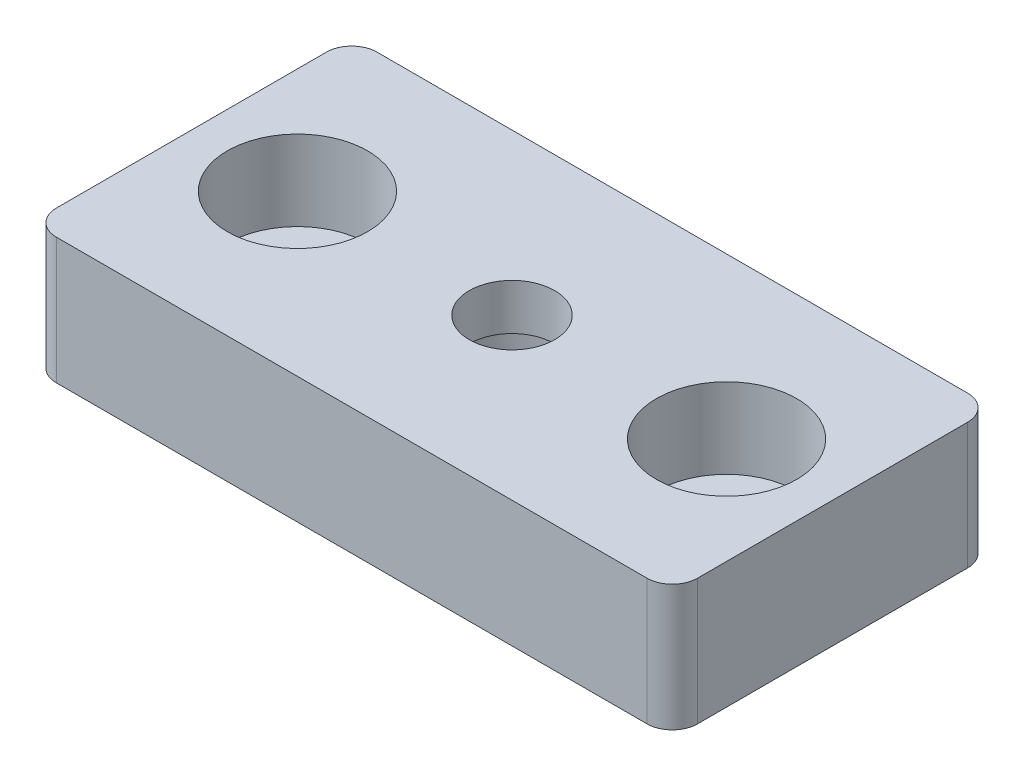
ISO-10303-21;
HEADER;
FILE_DESCRIPTION(('STEP AP214'),'2;1');
FILE_NAME('part.step','',(''),(''),'','','');
FILE_SCHEMA(('AUTOMOTIVE_DESIGN { 1 0 10303 214 1 1 1 1 }'));
ENDSEC;
DATA;
#1=APPLICATION_CONTEXT('core data for automotive mechanical design processes');
#2=APPLICATION_PROTOCOL_DEFINITION('international standard','automotive_design',2000,#1);
#3=PRODUCT_CONTEXT('',#1,'mechanical');
#4=PRODUCT('Part','Part','',(#3));
#5=PRODUCT_RELATED_PRODUCT_CATEGORY('part','',(#4));
#6=PRODUCT_DEFINITION_FORMATION('','',#4);
#7=PRODUCT_DEFINITION_CONTEXT('part definition',#1,'design');
#8=PRODUCT_DEFINITION('design','',#6,#7);
#9=PRODUCT_DEFINITION_SHAPE('','',#8);
#10=(LENGTH_UNIT() NAMED_UNIT(*) SI_UNIT(.MILLI.,.METRE.));
#11=(NAMED_UNIT(*) PLANE_ANGLE_UNIT() SI_UNIT($,.RADIAN.));
#12=(NAMED_UNIT(*) SI_UNIT($,.STERADIAN.) SOLID_ANGLE_UNIT());
#13=UNCERTAINTY_MEASURE_WITH_UNIT(LENGTH_MEASURE(1.E-05),#10,'distance_accuracy_value','');
#14=(GEOMETRIC_REPRESENTATION_CONTEXT(3) GLOBAL_UNCERTAINTY_ASSIGNED_CONTEXT((#13)) GLOBAL_UNIT_ASSIGNED_CONTEXT((#10,
#11,#12)) REPRESENTATION_CONTEXT('',''));
#15=CARTESIAN_POINT('',(0.,0.,0.));
#16=DIRECTION('',(0.,0.,1.));
#17=DIRECTION('',(1.,0.,0.));
#18=AXIS2_PLACEMENT_3D('',#15,#16,#17);
#19=CARTESIAN_POINT('',(-36.0718631178707,10.,-4.80475285171102));
#20=DIRECTION('',(1.,0.,0.));
#21=DIRECTION('',(0.,0.,-1.));
#22=AXIS2_PLACEMENT_3D('',#19,#20,#21);
#23=PLANE('',#22);
#24=DIRECTION('',(0.,0.,1.));
#25=VECTOR('',#24,1.);
#26=CARTESIAN_POINT('',(-36.0718631178707,0.,-4.80475285171102));
#27=LINE('',#26,#25);
#28=CARTESIAN_POINT('',(-36.0718631178707,0.,-2.80475285171102));
#29=VERTEX_POINT('',#28);
#30=CARTESIAN_POINT('',(-36.0718631178707,0.,18.595247148289));
#31=VERTEX_POINT('',#30);
#32=EDGE_CURVE('E156',#29,#31,#27,.T.);
#33=ORIENTED_EDGE('',*,*,#32,.T.);
#34=DIRECTION('',(0.,-1.,0.));
#35=VECTOR('',#34,1.);
#36=CARTESIAN_POINT('',(-36.0718631178707,10.,18.595247148289));
#37=LINE('',#36,#35);
#38=CARTESIAN_POINT('',(-36.0718631178707,10.,18.595247148289));
#39=VERTEX_POINT('',#38);
#40=EDGE_CURVE('E11',#31,#39,#37,.F.);
#41=ORIENTED_EDGE('',*,*,#40,.T.);
#42=DIRECTION('',(0.,0.,1.));
#43=VECTOR('',#42,1.);
#44=CARTESIAN_POINT('',(-36.0718631178707,10.,-4.80475285171102));
#45=LINE('',#44,#43);
#46=CARTESIAN_POINT('',(-36.0718631178707,10.,-2.80475285171102));
#47=VERTEX_POINT('',#46);
#48=EDGE_CURVE('E124',#47,#39,#45,.T.);
#49=ORIENTED_EDGE('',*,*,#48,.F.);
#50=DIRECTION('',(0.,-1.,0.));
#51=VECTOR('',#50,1.);
#52=CARTESIAN_POINT('',(-36.0718631178707,10.,-2.80475285171102));
#53=LINE('',#52,#51);
#54=EDGE_CURVE('E40',#47,#29,#53,.T.);
#55=ORIENTED_EDGE('',*,*,#54,.T.);
#56=EDGE_LOOP('',(#33,#41,#49,#55));
#57=FACE_BOUND('',#56,.T.);
#58=ADVANCED_FACE('F32',(#57),#23,.F.);
#59=CARTESIAN_POINT('',(-36.0718631178707,10.,20.595247148289));
#60=DIRECTION('',(0.,0.,-1.));
#61=DIRECTION('',(-1.,0.,0.));
#62=AXIS2_PLACEMENT_3D('',#59,#60,#61);
#63=PLANE('',#62);
#64=DIRECTION('',(1.,0.,0.));
#65=VECTOR('',#64,1.);
#66=CARTESIAN_POINT('',(-36.0718631178707,0.,20.595247148289));
#67=LINE('',#66,#65);
#68=CARTESIAN_POINT('',(-34.0718631178707,0.,20.595247148289));
#69=VERTEX_POINT('',#68);
#70=CARTESIAN_POINT('',(12.7281368821293,0.,20.595247148289));
#71=VERTEX_POINT('',#70);
#72=EDGE_CURVE('E129',#69,#71,#67,.T.);
#73=ORIENTED_EDGE('',*,*,#72,.T.);
#74=DIRECTION('',(0.,-1.,0.));
#75=VECTOR('',#74,1.);
#76=CARTESIAN_POINT('',(12.7281368821293,10.,20.595247148289));
#77=LINE('',#76,#75);
#78=CARTESIAN_POINT('',(12.7281368821293,10.,20.595247148289));
#79=VERTEX_POINT('',#78);
#80=EDGE_CURVE('E47',#71,#79,#77,.F.);
#81=ORIENTED_EDGE('',*,*,#80,.T.);
#82=DIRECTION('',(1.,0.,0.));
#83=VECTOR('',#82,1.);
#84=CARTESIAN_POINT('',(-36.0718631178707,10.,20.595247148289));
#85=LINE('',#84,#83);
#86=CARTESIAN_POINT('',(-34.0718631178707,10.,20.595247148289));
#87=VERTEX_POINT('',#86);
#88=EDGE_CURVE('E127',#87,#79,#85,.T.);
#89=ORIENTED_EDGE('',*,*,#88,.F.);
#90=DIRECTION('',(0.,-1.,0.));
#91=VECTOR('',#90,1.);
#92=CARTESIAN_POINT('',(-34.0718631178707,10.,20.595247148289));
#93=LINE('',#92,#91);
#94=EDGE_CURVE('E148',#87,#69,#93,.T.);
#95=ORIENTED_EDGE('',*,*,#94,.T.);
#96=EDGE_LOOP('',(#73,#81,#89,#95));
#97=FACE_BOUND('',#96,.T.);
#98=ADVANCED_FACE('F244',(#97),#63,.F.);
#99=CARTESIAN_POINT('',(14.7281368821293,10.,-4.80475285171102));
#100=DIRECTION('',(-1.,0.,0.));
#101=DIRECTION('',(0.,0.,1.));
#102=AXIS2_PLACEMENT_3D('',#99,#100,#101);
#103=PLANE('',#102);
#104=DIRECTION('',(0.,0.,-1.));
#105=VECTOR('',#104,1.);
#106=CARTESIAN_POINT('',(14.7281368821293,0.,-4.80475285171102));
#107=LINE('',#106,#105);
#108=CARTESIAN_POINT('',(14.7281368821293,0.,18.595247148289));
#109=VERTEX_POINT('',#108);
#110=CARTESIAN_POINT('',(14.7281368821293,0.,-2.80475285171102));
#111=VERTEX_POINT('',#110);
#112=EDGE_CURVE('E125',#109,#111,#107,.T.);
#113=ORIENTED_EDGE('',*,*,#112,.T.);
#114=DIRECTION('',(0.,-1.,0.));
#115=VECTOR('',#114,1.);
#116=CARTESIAN_POINT('',(14.7281368821293,10.,-2.80475285171102));
#117=LINE('',#116,#115);
#118=CARTESIAN_POINT('',(14.7281368821293,10.,-2.80475285171102));
#119=VERTEX_POINT('',#118);
#120=EDGE_CURVE('E103',#111,#119,#117,.F.);
#121=ORIENTED_EDGE('',*,*,#120,.T.);
#122=DIRECTION('',(0.,0.,-1.));
#123=VECTOR('',#122,1.);
#124=CARTESIAN_POINT('',(14.7281368821293,10.,-4.80475285171102));
#125=LINE('',#124,#123);
#126=CARTESIAN_POINT('',(14.7281368821293,10.,18.595247148289));
#127=VERTEX_POINT('',#126);
#128=EDGE_CURVE('E168',#127,#119,#125,.T.);
#129=ORIENTED_EDGE('',*,*,#128,.F.);
#130=DIRECTION('',(0.,-1.,0.));
#131=VECTOR('',#130,1.);
#132=CARTESIAN_POINT('',(14.7281368821293,10.,18.595247148289));
#133=LINE('',#132,#131);
#134=EDGE_CURVE('E108',#127,#109,#133,.T.);
#135=ORIENTED_EDGE('',*,*,#134,.T.);
#136=EDGE_LOOP('',(#113,#121,#129,#135));
#137=FACE_BOUND('',#136,.T.);
#138=ADVANCED_FACE('F241',(#137),#103,.F.);
#139=CARTESIAN_POINT('',(-36.0718631178707,10.,-4.80475285171102));
#140=DIRECTION('',(0.,0.,1.));
#141=DIRECTION('',(1.,0.,0.));
#142=AXIS2_PLACEMENT_3D('',#139,#140,#141);
#143=PLANE('',#142);
#144=DIRECTION('',(-1.,0.,0.));
#145=VECTOR('',#144,1.);
#146=CARTESIAN_POINT('',(-36.0718631178707,10.,-4.80475285171102));
#147=LINE('',#146,#145);
#148=CARTESIAN_POINT('',(12.7281368821293,10.,-4.80475285171102));
#149=VERTEX_POINT('',#148);
#150=CARTESIAN_POINT('',(-34.0718631178707,10.,-4.80475285171102));
#151=VERTEX_POINT('',#150);
#152=EDGE_CURVE('E118',#149,#151,#147,.T.);
#153=ORIENTED_EDGE('',*,*,#152,.F.);
#154=DIRECTION('',(0.,-1.,0.));
#155=VECTOR('',#154,1.);
#156=CARTESIAN_POINT('',(12.7281368821293,10.,-4.80475285171102));
#157=LINE('',#156,#155);
#158=CARTESIAN_POINT('',(12.7281368821293,0.,-4.80475285171102));
#159=VERTEX_POINT('',#158);
#160=EDGE_CURVE('E102',#149,#159,#157,.T.);
#161=ORIENTED_EDGE('',*,*,#160,.T.);
#162=DIRECTION('',(-1.,0.,0.));
#163=VECTOR('',#162,1.);
#164=CARTESIAN_POINT('',(-36.0718631178707,0.,-4.80475285171102));
#165=LINE('',#164,#163);
#166=CARTESIAN_POINT('',(-34.0718631178707,0.,-4.80475285171102));
#167=VERTEX_POINT('',#166);
#168=EDGE_CURVE('E115',#159,#167,#165,.T.);
#169=ORIENTED_EDGE('',*,*,#168,.T.);
#170=DIRECTION('',(0.,-1.,0.));
#171=VECTOR('',#170,1.);
#172=CARTESIAN_POINT('',(-34.0718631178707,10.,-4.80475285171102));
#173=LINE('',#172,#171);
#174=EDGE_CURVE('E120',#167,#151,#173,.F.);
#175=ORIENTED_EDGE('',*,*,#174,.T.);
#176=EDGE_LOOP('',(#153,#161,#169,#175));
#177=FACE_BOUND('',#176,.T.);
#178=ADVANCED_FACE('F114',(#177),#143,.F.);
#179=CARTESIAN_POINT('',(0.,10.,0.));
#180=DIRECTION('',(0.,1.,0.));
#181=DIRECTION('',(0.,0.,1.));
#182=AXIS2_PLACEMENT_3D('',#179,#180,#181);
#183=PLANE('',#182);
#184=CARTESIAN_POINT('',(-10.6718631178707,10.,7.89524714828898));
#185=DIRECTION('',(0.,-1.,0.));
#186=DIRECTION('',(0.,0.,-1.));
#187=AXIS2_PLACEMENT_3D('',#184,#185,#186);
#188=CIRCLE('',#187,3.3782);
#189=CARTESIAN_POINT('',(-10.6718631178707,10.,4.51704714828898));
#190=VERTEX_POINT('',#189);
#191=EDGE_CURVE('E192',#190,#190,#188,.T.);
#192=ORIENTED_EDGE('',*,*,#191,.T.);
#193=EDGE_LOOP('',(#192));
#194=FACE_BOUND('',#193,.T.);
#195=CARTESIAN_POINT('',(-27.6718631178707,10.,7.89524714828898));
#196=DIRECTION('',(0.,1.,0.));
#197=DIRECTION('',(0.,0.,1.));
#198=AXIS2_PLACEMENT_3D('',#195,#196,#197);
#199=CIRCLE('',#198,5.55625);
#200=CARTESIAN_POINT('',(-27.6718631178707,10.,13.451497148289));
#201=VERTEX_POINT('',#200);
#202=EDGE_CURVE('E189',#201,#201,#199,.T.);
#203=ORIENTED_EDGE('',*,*,#202,.F.);
#204=EDGE_LOOP('',(#203));
#205=FACE_BOUND('',#204,.T.);
#206=CARTESIAN_POINT('',(6.32813688212928,10.,7.89524714828898));
#207=DIRECTION('',(0.,1.,0.));
#208=DIRECTION('',(0.,0.,1.));
#209=AXIS2_PLACEMENT_3D('',#206,#207,#208);
#210=CIRCLE('',#209,5.55625);
#211=CARTESIAN_POINT('',(6.32813688212928,10.,13.451497148289));
#212=VERTEX_POINT('',#211);
#213=EDGE_CURVE('E177',#212,#212,#210,.T.);
#214=ORIENTED_EDGE('',*,*,#213,.F.);
#215=EDGE_LOOP('',(#214));
#216=FACE_BOUND('',#215,.T.);
#217=ORIENTED_EDGE('',*,*,#128,.T.);
#218=CARTESIAN_POINT('',(12.7281368821293,10.,-2.80475285171102));
#219=DIRECTION('',(0.,1.,0.));
#220=DIRECTION('',(0.,0.,1.));
#221=AXIS2_PLACEMENT_3D('',#218,#219,#220);
#222=CIRCLE('',#221,2.);
#223=EDGE_CURVE('E146',#119,#149,#222,.T.);
#224=ORIENTED_EDGE('',*,*,#223,.T.);
#225=ORIENTED_EDGE('',*,*,#152,.T.);
#226=CARTESIAN_POINT('',(-34.0718631178707,10.,-2.80475285171102));
#227=DIRECTION('',(0.,1.,0.));
#228=DIRECTION('',(0.,0.,1.));
#229=AXIS2_PLACEMENT_3D('',#226,#227,#228);
#230=CIRCLE('',#229,2.);
#231=EDGE_CURVE('E141',#151,#47,#230,.T.);
#232=ORIENTED_EDGE('',*,*,#231,.T.);
#233=ORIENTED_EDGE('',*,*,#48,.T.);
#234=CARTESIAN_POINT('',(-34.0718631178707,10.,18.595247148289));
#235=DIRECTION('',(0.,1.,0.));
#236=DIRECTION('',(0.,0.,1.));
#237=AXIS2_PLACEMENT_3D('',#234,#235,#236);
#238=CIRCLE('',#237,2.);
#239=EDGE_CURVE('E54',#39,#87,#238,.T.);
#240=ORIENTED_EDGE('',*,*,#239,.T.);
#241=ORIENTED_EDGE('',*,*,#88,.T.);
#242=CARTESIAN_POINT('',(12.7281368821293,10.,18.595247148289));
#243=DIRECTION('',(0.,1.,0.));
#244=DIRECTION('',(0.,0.,1.));
#245=AXIS2_PLACEMENT_3D('',#242,#243,#244);
#246=CIRCLE('',#245,2.);
#247=EDGE_CURVE('E144',#79,#127,#246,.T.);
#248=ORIENTED_EDGE('',*,*,#247,.T.);
#249=EDGE_LOOP('',(#217,#224,#225,#232,#233,#240,#241,#248));
#250=FACE_BOUND('',#249,.T.);
#251=ADVANCED_FACE('F210',(#194,#205,#216,#250),#183,.T.);
#252=CARTESIAN_POINT('',(0.,0.,0.));
#253=DIRECTION('',(0.,1.,0.));
#254=DIRECTION('',(0.,0.,1.));
#255=AXIS2_PLACEMENT_3D('',#252,#253,#254);
#256=PLANE('',#255);
#257=CARTESIAN_POINT('',(-10.6718631178707,0.,7.89524714828898));
#258=DIRECTION('',(0.,-1.,0.));
#259=DIRECTION('',(0.,0.,-1.));
#260=AXIS2_PLACEMENT_3D('',#257,#258,#259);
#261=CIRCLE('',#260,5.55625);
#262=CARTESIAN_POINT('',(-10.6718631178707,0.,2.33899714828898));
#263=VERTEX_POINT('',#262);
#264=EDGE_CURVE('E201',#263,#263,#261,.T.);
#265=ORIENTED_EDGE('',*,*,#264,.F.);
#266=EDGE_LOOP('',(#265));
#267=FACE_BOUND('',#266,.T.);
#268=CARTESIAN_POINT('',(-27.6718631178707,0.,7.89524714828898));
#269=DIRECTION('',(0.,1.,0.));
#270=DIRECTION('',(0.,0.,1.));
#271=AXIS2_PLACEMENT_3D('',#268,#269,#270);
#272=CIRCLE('',#271,3.3782);
#273=CARTESIAN_POINT('',(-27.6718631178707,0.,11.273447148289));
#274=VERTEX_POINT('',#273);
#275=EDGE_CURVE('E180',#274,#274,#272,.T.);
#276=ORIENTED_EDGE('',*,*,#275,.T.);
#277=EDGE_LOOP('',(#276));
#278=FACE_BOUND('',#277,.T.);
#279=CARTESIAN_POINT('',(6.32813688212928,0.,7.89524714828898));
#280=DIRECTION('',(0.,1.,0.));
#281=DIRECTION('',(0.,0.,1.));
#282=AXIS2_PLACEMENT_3D('',#279,#280,#281);
#283=CIRCLE('',#282,3.3782);
#284=CARTESIAN_POINT('',(6.32813688212928,0.,11.273447148289));
#285=VERTEX_POINT('',#284);
#286=EDGE_CURVE('E161',#285,#285,#283,.T.);
#287=ORIENTED_EDGE('',*,*,#286,.T.);
#288=EDGE_LOOP('',(#287));
#289=FACE_BOUND('',#288,.T.);
#290=ORIENTED_EDGE('',*,*,#168,.F.);
#291=CARTESIAN_POINT('',(12.7281368821293,0.,-2.80475285171102));
#292=DIRECTION('',(0.,1.,0.));
#293=DIRECTION('',(0.,0.,1.));
#294=AXIS2_PLACEMENT_3D('',#291,#292,#293);
#295=CIRCLE('',#294,2.);
#296=EDGE_CURVE('E98',#159,#111,#295,.F.);
#297=ORIENTED_EDGE('',*,*,#296,.T.);
#298=ORIENTED_EDGE('',*,*,#112,.F.);
#299=CARTESIAN_POINT('',(12.7281368821293,0.,18.595247148289));
#300=DIRECTION('',(0.,1.,0.));
#301=DIRECTION('',(0.,0.,1.));
#302=AXIS2_PLACEMENT_3D('',#299,#300,#301);
#303=CIRCLE('',#302,2.);
#304=EDGE_CURVE('E109',#109,#71,#303,.F.);
#305=ORIENTED_EDGE('',*,*,#304,.T.);
#306=ORIENTED_EDGE('',*,*,#72,.F.);
#307=CARTESIAN_POINT('',(-34.0718631178707,0.,18.595247148289));
#308=DIRECTION('',(0.,1.,0.));
#309=DIRECTION('',(0.,0.,1.));
#310=AXIS2_PLACEMENT_3D('',#307,#308,#309);
#311=CIRCLE('',#310,2.);
#312=EDGE_CURVE('E135',#69,#31,#311,.F.);
#313=ORIENTED_EDGE('',*,*,#312,.T.);
#314=ORIENTED_EDGE('',*,*,#32,.F.);
#315=CARTESIAN_POINT('',(-34.0718631178707,0.,-2.80475285171102));
#316=DIRECTION('',(0.,1.,0.));
#317=DIRECTION('',(0.,0.,1.));
#318=AXIS2_PLACEMENT_3D('',#315,#316,#317);
#319=CIRCLE('',#318,2.);
#320=EDGE_CURVE('E119',#29,#167,#319,.F.);
#321=ORIENTED_EDGE('',*,*,#320,.T.);
#322=EDGE_LOOP('',(#290,#297,#298,#305,#306,#313,#314,#321));
#323=FACE_BOUND('',#322,.T.);
#324=ADVANCED_FACE('F122',(#267,#278,#289,#323),#256,.F.);
#325=CARTESIAN_POINT('',(6.32813688212928,10.,7.89524714828898));
#326=DIRECTION('',(0.,1.,0.));
#327=DIRECTION('',(0.,0.,1.));
#328=AXIS2_PLACEMENT_3D('',#325,#326,#327);
#329=CYLINDRICAL_SURFACE('',#328,3.3782);
#330=ORIENTED_EDGE('',*,*,#286,.F.);
#331=EDGE_LOOP('',(#330));
#332=FACE_BOUND('',#331,.T.);
#333=CARTESIAN_POINT('',(6.32813688212928,3.65,7.89524714828898));
#334=DIRECTION('',(0.,1.,0.));
#335=DIRECTION('',(0.,0.,1.));
#336=AXIS2_PLACEMENT_3D('',#333,#334,#335);
#337=CIRCLE('',#336,3.3782);
#338=CARTESIAN_POINT('',(6.32813688212928,3.65,11.273447148289));
#339=VERTEX_POINT('',#338);
#340=EDGE_CURVE('E164',#339,#339,#337,.T.);
#341=ORIENTED_EDGE('',*,*,#340,.T.);
#342=EDGE_LOOP('',(#341));
#343=FACE_BOUND('',#342,.T.);
#344=ADVANCED_FACE('F209',(#332,#343),#329,.F.);
#345=CARTESIAN_POINT('',(9.70633688212927,3.65,7.89524714828898));
#346=DIRECTION('',(0.,-1.,0.));
#347=DIRECTION('',(0.,0.,-1.));
#348=AXIS2_PLACEMENT_3D('',#345,#346,#347);
#349=PLANE('',#348);
#350=ORIENTED_EDGE('',*,*,#340,.F.);
#351=EDGE_LOOP('',(#350));
#352=FACE_BOUND('',#351,.T.);
#353=CARTESIAN_POINT('',(6.32813688212928,3.65,7.89524714828898));
#354=DIRECTION('',(0.,1.,0.));
#355=DIRECTION('',(0.,0.,1.));
#356=AXIS2_PLACEMENT_3D('',#353,#354,#355);
#357=CIRCLE('',#356,5.55625);
#358=CARTESIAN_POINT('',(6.32813688212928,3.65,13.451497148289));
#359=VERTEX_POINT('',#358);
#360=EDGE_CURVE('E174',#359,#359,#357,.T.);
#361=ORIENTED_EDGE('',*,*,#360,.T.);
#362=EDGE_LOOP('',(#361));
#363=FACE_BOUND('',#362,.T.);
#364=ADVANCED_FACE('F218',(#352,#363),#349,.F.);
#365=CARTESIAN_POINT('',(6.32813688212928,10.,7.89524714828898));
#366=DIRECTION('',(0.,1.,0.));
#367=DIRECTION('',(0.,0.,1.));
#368=AXIS2_PLACEMENT_3D('',#365,#366,#367);
#369=CYLINDRICAL_SURFACE('',#368,5.55625);
#370=ORIENTED_EDGE('',*,*,#360,.F.);
#371=EDGE_LOOP('',(#370));
#372=FACE_BOUND('',#371,.T.);
#373=ORIENTED_EDGE('',*,*,#213,.T.);
#374=EDGE_LOOP('',(#373));
#375=FACE_BOUND('',#374,.T.);
#376=ADVANCED_FACE('F224',(#372,#375),#369,.F.);
#377=CARTESIAN_POINT('',(-27.6718631178707,10.,7.89524714828898));
#378=DIRECTION('',(0.,1.,0.));
#379=DIRECTION('',(0.,0.,1.));
#380=AXIS2_PLACEMENT_3D('',#377,#378,#379);
#381=CYLINDRICAL_SURFACE('',#380,3.3782);
#382=ORIENTED_EDGE('',*,*,#275,.F.);
#383=EDGE_LOOP('',(#382));
#384=FACE_BOUND('',#383,.T.);
#385=CARTESIAN_POINT('',(-27.6718631178707,3.65,7.89524714828898));
#386=DIRECTION('',(0.,1.,0.));
#387=DIRECTION('',(0.,0.,1.));
#388=AXIS2_PLACEMENT_3D('',#385,#386,#387);
#389=CIRCLE('',#388,3.3782);
#390=CARTESIAN_POINT('',(-27.6718631178707,3.65,11.273447148289));
#391=VERTEX_POINT('',#390);
#392=EDGE_CURVE('E183',#391,#391,#389,.T.);
#393=ORIENTED_EDGE('',*,*,#392,.T.);
#394=EDGE_LOOP('',(#393));
#395=FACE_BOUND('',#394,.T.);
#396=ADVANCED_FACE('F230',(#384,#395),#381,.F.);
#397=CARTESIAN_POINT('',(-24.2936631178707,3.65,7.89524714828898));
#398=DIRECTION('',(0.,-1.,0.));
#399=DIRECTION('',(0.,0.,-1.));
#400=AXIS2_PLACEMENT_3D('',#397,#398,#399);
#401=PLANE('',#400);
#402=ORIENTED_EDGE('',*,*,#392,.F.);
#403=EDGE_LOOP('',(#402));
#404=FACE_BOUND('',#403,.T.);
#405=CARTESIAN_POINT('',(-27.6718631178707,3.65,7.89524714828898));
#406=DIRECTION('',(0.,1.,0.));
#407=DIRECTION('',(0.,0.,1.));
#408=AXIS2_PLACEMENT_3D('',#405,#406,#407);
#409=CIRCLE('',#408,5.55625);
#410=CARTESIAN_POINT('',(-27.6718631178707,3.65,13.451497148289));
#411=VERTEX_POINT('',#410);
#412=EDGE_CURVE('E186',#411,#411,#409,.T.);
#413=ORIENTED_EDGE('',*,*,#412,.T.);
#414=EDGE_LOOP('',(#413));
#415=FACE_BOUND('',#414,.T.);
#416=ADVANCED_FACE('F319',(#404,#415),#401,.F.);
#417=CARTESIAN_POINT('',(-27.6718631178707,10.,7.89524714828898));
#418=DIRECTION('',(0.,1.,0.));
#419=DIRECTION('',(0.,0.,1.));
#420=AXIS2_PLACEMENT_3D('',#417,#418,#419);
#421=CYLINDRICAL_SURFACE('',#420,5.55625);
#422=ORIENTED_EDGE('',*,*,#412,.F.);
#423=EDGE_LOOP('',(#422));
#424=FACE_BOUND('',#423,.T.);
#425=ORIENTED_EDGE('',*,*,#202,.T.);
#426=EDGE_LOOP('',(#425));
#427=FACE_BOUND('',#426,.T.);
#428=ADVANCED_FACE('F310',(#424,#427),#421,.F.);
#429=CARTESIAN_POINT('',(-10.6718631178707,0.,7.89524714828898));
#430=DIRECTION('',(0.,-1.,0.));
#431=DIRECTION('',(0.,0.,-1.));
#432=AXIS2_PLACEMENT_3D('',#429,#430,#431);
#433=CYLINDRICAL_SURFACE('',#432,3.3782);
#434=ORIENTED_EDGE('',*,*,#191,.F.);
#435=EDGE_LOOP('',(#434));
#436=FACE_BOUND('',#435,.T.);
#437=CARTESIAN_POINT('',(-10.6718631178707,6.35,7.89524714828898));
#438=DIRECTION('',(0.,-1.,0.));
#439=DIRECTION('',(0.,0.,-1.));
#440=AXIS2_PLACEMENT_3D('',#437,#438,#439);
#441=CIRCLE('',#440,3.37820000000001);
#442=CARTESIAN_POINT('',(-10.6718631178707,6.35,4.51704714828897));
#443=VERTEX_POINT('',#442);
#444=EDGE_CURVE('E195',#443,#443,#441,.T.);
#445=ORIENTED_EDGE('',*,*,#444,.T.);
#446=EDGE_LOOP('',(#445));
#447=FACE_BOUND('',#446,.T.);
#448=ADVANCED_FACE('F301',(#436,#447),#433,.F.);
#449=CARTESIAN_POINT('',(-7.29366311787071,6.35,7.89524714828898));
#450=DIRECTION('',(0.,1.,0.));
#451=DIRECTION('',(0.,0.,1.));
#452=AXIS2_PLACEMENT_3D('',#449,#450,#451);
#453=PLANE('',#452);
#454=ORIENTED_EDGE('',*,*,#444,.F.);
#455=EDGE_LOOP('',(#454));
#456=FACE_BOUND('',#455,.T.);
#457=CARTESIAN_POINT('',(-10.6718631178707,6.35,7.89524714828898));
#458=DIRECTION('',(0.,-1.,0.));
#459=DIRECTION('',(0.,0.,-1.));
#460=AXIS2_PLACEMENT_3D('',#457,#458,#459);
#461=CIRCLE('',#460,5.55625);
#462=CARTESIAN_POINT('',(-10.6718631178707,6.35,2.33899714828898));
#463=VERTEX_POINT('',#462);
#464=EDGE_CURVE('E198',#463,#463,#461,.T.);
#465=ORIENTED_EDGE('',*,*,#464,.T.);
#466=EDGE_LOOP('',(#465));
#467=FACE_BOUND('',#466,.T.);
#468=ADVANCED_FACE('F292',(#456,#467),#453,.F.);
#469=CARTESIAN_POINT('',(-10.6718631178707,0.,7.89524714828898));
#470=DIRECTION('',(0.,-1.,0.));
#471=DIRECTION('',(0.,0.,-1.));
#472=AXIS2_PLACEMENT_3D('',#469,#470,#471);
#473=CYLINDRICAL_SURFACE('',#472,5.55625);
#474=ORIENTED_EDGE('',*,*,#464,.F.);
#475=EDGE_LOOP('',(#474));
#476=FACE_BOUND('',#475,.T.);
#477=ORIENTED_EDGE('',*,*,#264,.T.);
#478=EDGE_LOOP('',(#477));
#479=FACE_BOUND('',#478,.T.);
#480=ADVANCED_FACE('F205',(#476,#479),#473,.F.);
#481=CARTESIAN_POINT('',(12.7281368821293,10.,-2.80475285171102));
#482=DIRECTION('',(0.,-1.,0.));
#483=DIRECTION('',(0.,0.,-1.));
#484=AXIS2_PLACEMENT_3D('',#481,#482,#483);
#485=CYLINDRICAL_SURFACE('',#484,2.);
#486=ORIENTED_EDGE('',*,*,#223,.F.);
#487=ORIENTED_EDGE('',*,*,#120,.F.);
#488=ORIENTED_EDGE('',*,*,#296,.F.);
#489=ORIENTED_EDGE('',*,*,#160,.F.);
#490=EDGE_LOOP('',(#486,#487,#488,#489));
#491=FACE_BOUND('',#490,.T.);
#492=ADVANCED_FACE('F101',(#491),#485,.T.);
#493=CARTESIAN_POINT('',(12.7281368821293,10.,18.595247148289));
#494=DIRECTION('',(0.,-1.,0.));
#495=DIRECTION('',(0.,0.,-1.));
#496=AXIS2_PLACEMENT_3D('',#493,#494,#495);
#497=CYLINDRICAL_SURFACE('',#496,2.);
#498=ORIENTED_EDGE('',*,*,#247,.F.);
#499=ORIENTED_EDGE('',*,*,#80,.F.);
#500=ORIENTED_EDGE('',*,*,#304,.F.);
#501=ORIENTED_EDGE('',*,*,#134,.F.);
#502=EDGE_LOOP('',(#498,#499,#500,#501));
#503=FACE_BOUND('',#502,.T.);
#504=ADVANCED_FACE('F243',(#503),#497,.T.);
#505=CARTESIAN_POINT('',(-34.0718631178707,10.,18.595247148289));
#506=DIRECTION('',(0.,-1.,0.));
#507=DIRECTION('',(0.,0.,-1.));
#508=AXIS2_PLACEMENT_3D('',#505,#506,#507);
#509=CYLINDRICAL_SURFACE('',#508,2.);
#510=ORIENTED_EDGE('',*,*,#239,.F.);
#511=ORIENTED_EDGE('',*,*,#40,.F.);
#512=ORIENTED_EDGE('',*,*,#312,.F.);
#513=ORIENTED_EDGE('',*,*,#94,.F.);
#514=EDGE_LOOP('',(#510,#511,#512,#513));
#515=FACE_BOUND('',#514,.T.);
#516=ADVANCED_FACE('F247',(#515),#509,.T.);
#517=CARTESIAN_POINT('',(-34.0718631178707,10.,-2.80475285171102));
#518=DIRECTION('',(0.,-1.,0.));
#519=DIRECTION('',(0.,0.,-1.));
#520=AXIS2_PLACEMENT_3D('',#517,#518,#519);
#521=CYLINDRICAL_SURFACE('',#520,2.);
#522=ORIENTED_EDGE('',*,*,#231,.F.);
#523=ORIENTED_EDGE('',*,*,#174,.F.);
#524=ORIENTED_EDGE('',*,*,#320,.F.);
#525=ORIENTED_EDGE('',*,*,#54,.F.);
#526=EDGE_LOOP('',(#522,#523,#524,#525));
#527=FACE_BOUND('',#526,.T.);
#528=ADVANCED_FACE('F34',(#527),#521,.T.);
#529=CLOSED_SHELL('',(#58,#98,#138,#178,#251,#324,#344,#364,#376,#396,#416,#428,#448,#468,#480,
#492,#504,#516,#528));
#530=MANIFOLD_SOLID_BREP('B2',#529);
#531=ADVANCED_BREP_SHAPE_REPRESENTATION('',(#18,#530),#14);
#532=SHAPE_DEFINITION_REPRESENTATION(#9,#531);
ENDSEC;
END-ISO-10303-21;
